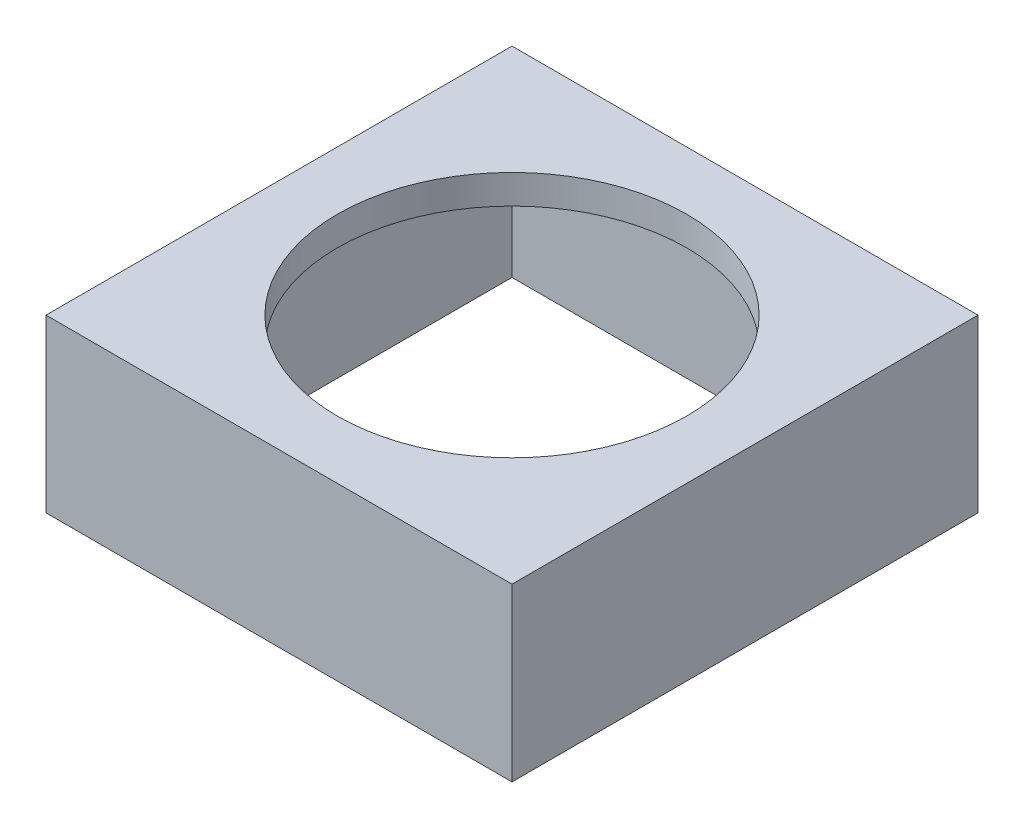
ISO-10303-21;
HEADER;
FILE_DESCRIPTION(('STEP AP214'),'2;1');
FILE_NAME('part.step','',(''),(''),'','','');
FILE_SCHEMA(('AUTOMOTIVE_DESIGN { 1 0 10303 214 1 1 1 1 }'));
ENDSEC;
DATA;
#1=APPLICATION_CONTEXT('core data for automotive mechanical design processes');
#2=APPLICATION_PROTOCOL_DEFINITION('international standard','automotive_design',2000,#1);
#3=PRODUCT_CONTEXT('',#1,'mechanical');
#4=PRODUCT('Part','Part','',(#3));
#5=PRODUCT_RELATED_PRODUCT_CATEGORY('part','',(#4));
#6=PRODUCT_DEFINITION_FORMATION('','',#4);
#7=PRODUCT_DEFINITION_CONTEXT('part definition',#1,'design');
#8=PRODUCT_DEFINITION('design','',#6,#7);
#9=PRODUCT_DEFINITION_SHAPE('','',#8);
#10=(LENGTH_UNIT() NAMED_UNIT(*) SI_UNIT(.MILLI.,.METRE.));
#11=(NAMED_UNIT(*) PLANE_ANGLE_UNIT() SI_UNIT($,.RADIAN.));
#12=(NAMED_UNIT(*) SI_UNIT($,.STERADIAN.) SOLID_ANGLE_UNIT());
#13=UNCERTAINTY_MEASURE_WITH_UNIT(LENGTH_MEASURE(1.E-05),#10,'distance_accuracy_value','');
#14=(GEOMETRIC_REPRESENTATION_CONTEXT(3) GLOBAL_UNCERTAINTY_ASSIGNED_CONTEXT((#13)) GLOBAL_UNIT_ASSIGNED_CONTEXT((#10,
#11,#12)) REPRESENTATION_CONTEXT('',''));
#15=CARTESIAN_POINT('',(0.,0.,0.));
#16=DIRECTION('',(0.,0.,1.));
#17=DIRECTION('',(1.,0.,0.));
#18=AXIS2_PLACEMENT_3D('',#15,#16,#17);
#19=CARTESIAN_POINT('',(-3.5,2.94,-3.5));
#20=DIRECTION('',(1.,0.,0.));
#21=DIRECTION('',(0.,0.,-1.));
#22=AXIS2_PLACEMENT_3D('',#19,#20,#21);
#23=PLANE('',#22);
#24=DIRECTION('',(0.,-1.,0.));
#25=VECTOR('',#24,1.);
#26=CARTESIAN_POINT('',(-3.5,2.94,-3.5));
#27=LINE('',#26,#25);
#28=CARTESIAN_POINT('',(-3.5,2.44,-3.5));
#29=VERTEX_POINT('',#28);
#30=CARTESIAN_POINT('',(-3.5,0.,-3.5));
#31=VERTEX_POINT('',#30);
#32=EDGE_CURVE('E58',#29,#31,#27,.T.);
#33=ORIENTED_EDGE('',*,*,#32,.F.);
#34=DIRECTION('',(0.,0.,1.));
#35=VECTOR('',#34,1.);
#36=CARTESIAN_POINT('',(-3.5,2.44,-3.5));
#37=LINE('',#36,#35);
#38=CARTESIAN_POINT('',(-3.5,2.44,3.5));
#39=VERTEX_POINT('',#38);
#40=EDGE_CURVE('E52',#29,#39,#37,.T.);
#41=ORIENTED_EDGE('',*,*,#40,.T.);
#42=DIRECTION('',(0.,-1.,0.));
#43=VECTOR('',#42,1.);
#44=CARTESIAN_POINT('',(-3.5,2.94,3.5));
#45=LINE('',#44,#43);
#46=CARTESIAN_POINT('',(-3.5,0.,3.5));
#47=VERTEX_POINT('',#46);
#48=EDGE_CURVE('E119',#39,#47,#45,.T.);
#49=ORIENTED_EDGE('',*,*,#48,.T.);
#50=DIRECTION('',(0.,0.,1.));
#51=VECTOR('',#50,1.);
#52=CARTESIAN_POINT('',(-3.5,0.,-3.5));
#53=LINE('',#52,#51);
#54=EDGE_CURVE('E187',#31,#47,#53,.T.);
#55=ORIENTED_EDGE('',*,*,#54,.F.);
#56=EDGE_LOOP('',(#33,#41,#49,#55));
#57=FACE_BOUND('',#56,.T.);
#58=ADVANCED_FACE('F37',(#57),#23,.T.);
#59=CARTESIAN_POINT('',(-3.5,2.94,3.5));
#60=DIRECTION('',(0.,0.,-1.));
#61=DIRECTION('',(-1.,0.,0.));
#62=AXIS2_PLACEMENT_3D('',#59,#60,#61);
#63=PLANE('',#62);
#64=ORIENTED_EDGE('',*,*,#48,.F.);
#65=DIRECTION('',(1.,0.,0.));
#66=VECTOR('',#65,1.);
#67=CARTESIAN_POINT('',(-3.5,2.44,3.5));
#68=LINE('',#67,#66);
#69=CARTESIAN_POINT('',(3.5,2.44,3.5));
#70=VERTEX_POINT('',#69);
#71=EDGE_CURVE('E111',#39,#70,#68,.T.);
#72=ORIENTED_EDGE('',*,*,#71,.T.);
#73=DIRECTION('',(0.,-1.,0.));
#74=VECTOR('',#73,1.);
#75=CARTESIAN_POINT('',(3.5,2.94,3.5));
#76=LINE('',#75,#74);
#77=CARTESIAN_POINT('',(3.5,0.,3.5));
#78=VERTEX_POINT('',#77);
#79=EDGE_CURVE('E110',#70,#78,#76,.T.);
#80=ORIENTED_EDGE('',*,*,#79,.T.);
#81=DIRECTION('',(1.,0.,0.));
#82=VECTOR('',#81,1.);
#83=CARTESIAN_POINT('',(-3.5,0.,3.5));
#84=LINE('',#83,#82);
#85=EDGE_CURVE('E190',#47,#78,#84,.T.);
#86=ORIENTED_EDGE('',*,*,#85,.F.);
#87=EDGE_LOOP('',(#64,#72,#80,#86));
#88=FACE_BOUND('',#87,.T.);
#89=ADVANCED_FACE('F197',(#88),#63,.T.);
#90=CARTESIAN_POINT('',(3.5,2.94,-3.5));
#91=DIRECTION('',(-1.,0.,0.));
#92=DIRECTION('',(0.,0.,1.));
#93=AXIS2_PLACEMENT_3D('',#90,#91,#92);
#94=PLANE('',#93);
#95=ORIENTED_EDGE('',*,*,#79,.F.);
#96=DIRECTION('',(0.,0.,-1.));
#97=VECTOR('',#96,1.);
#98=CARTESIAN_POINT('',(3.5,2.44,-3.5));
#99=LINE('',#98,#97);
#100=CARTESIAN_POINT('',(3.5,2.44,-3.5));
#101=VERTEX_POINT('',#100);
#102=EDGE_CURVE('E102',#70,#101,#99,.T.);
#103=ORIENTED_EDGE('',*,*,#102,.T.);
#104=DIRECTION('',(0.,-1.,0.));
#105=VECTOR('',#104,1.);
#106=CARTESIAN_POINT('',(3.5,2.94,-3.5));
#107=LINE('',#106,#105);
#108=CARTESIAN_POINT('',(3.5,0.,-3.5));
#109=VERTEX_POINT('',#108);
#110=EDGE_CURVE('E109',#101,#109,#107,.T.);
#111=ORIENTED_EDGE('',*,*,#110,.T.);
#112=DIRECTION('',(0.,0.,-1.));
#113=VECTOR('',#112,1.);
#114=CARTESIAN_POINT('',(3.5,0.,-3.5));
#115=LINE('',#114,#113);
#116=EDGE_CURVE('E193',#78,#109,#115,.T.);
#117=ORIENTED_EDGE('',*,*,#116,.F.);
#118=EDGE_LOOP('',(#95,#103,#111,#117));
#119=FACE_BOUND('',#118,.T.);
#120=ADVANCED_FACE('F107',(#119),#94,.T.);
#121=CARTESIAN_POINT('',(-3.5,2.94,-3.5));
#122=DIRECTION('',(0.,0.,1.));
#123=DIRECTION('',(1.,0.,0.));
#124=AXIS2_PLACEMENT_3D('',#121,#122,#123);
#125=PLANE('',#124);
#126=ORIENTED_EDGE('',*,*,#110,.F.);
#127=DIRECTION('',(-1.,0.,0.));
#128=VECTOR('',#127,1.);
#129=CARTESIAN_POINT('',(-3.5,2.44,-3.5));
#130=LINE('',#129,#128);
#131=EDGE_CURVE('E11',#101,#29,#130,.T.);
#132=ORIENTED_EDGE('',*,*,#131,.T.);
#133=ORIENTED_EDGE('',*,*,#32,.T.);
#134=DIRECTION('',(-1.,0.,0.));
#135=VECTOR('',#134,1.);
#136=CARTESIAN_POINT('',(-3.5,0.,-3.5));
#137=LINE('',#136,#135);
#138=EDGE_CURVE('E116',#109,#31,#137,.T.);
#139=ORIENTED_EDGE('',*,*,#138,.F.);
#140=EDGE_LOOP('',(#126,#132,#133,#139));
#141=FACE_BOUND('',#140,.T.);
#142=ADVANCED_FACE('F114',(#141),#125,.T.);
#143=CARTESIAN_POINT('',(0.,2.94,0.));
#144=DIRECTION('',(0.,1.,0.));
#145=DIRECTION('',(0.,0.,1.));
#146=AXIS2_PLACEMENT_3D('',#143,#144,#145);
#147=PLANE('',#146);
#148=DIRECTION('',(0.,0.,1.));
#149=VECTOR('',#148,1.);
#150=CARTESIAN_POINT('',(-4.,2.94,-4.));
#151=LINE('',#150,#149);
#152=CARTESIAN_POINT('',(-4.,2.94,-4.));
#153=VERTEX_POINT('',#152);
#154=CARTESIAN_POINT('',(-4.,2.94,4.));
#155=VERTEX_POINT('',#154);
#156=EDGE_CURVE('E126',#153,#155,#151,.T.);
#157=ORIENTED_EDGE('',*,*,#156,.T.);
#158=DIRECTION('',(1.,0.,0.));
#159=VECTOR('',#158,1.);
#160=CARTESIAN_POINT('',(-4.,2.94,4.));
#161=LINE('',#160,#159);
#162=CARTESIAN_POINT('',(4.,2.94,4.));
#163=VERTEX_POINT('',#162);
#164=EDGE_CURVE('E129',#155,#163,#161,.T.);
#165=ORIENTED_EDGE('',*,*,#164,.T.);
#166=DIRECTION('',(0.,0.,-1.));
#167=VECTOR('',#166,1.);
#168=CARTESIAN_POINT('',(4.,2.94,-4.));
#169=LINE('',#168,#167);
#170=CARTESIAN_POINT('',(4.,2.94,-4.));
#171=VERTEX_POINT('',#170);
#172=EDGE_CURVE('E132',#163,#171,#169,.T.);
#173=ORIENTED_EDGE('',*,*,#172,.T.);
#174=DIRECTION('',(-1.,0.,0.));
#175=VECTOR('',#174,1.);
#176=CARTESIAN_POINT('',(-4.,2.94,-4.));
#177=LINE('',#176,#175);
#178=EDGE_CURVE('E134',#171,#153,#177,.T.);
#179=ORIENTED_EDGE('',*,*,#178,.T.);
#180=EDGE_LOOP('',(#157,#165,#173,#179));
#181=FACE_BOUND('',#180,.T.);
#182=CARTESIAN_POINT('',(0.,2.94,0.));
#183=DIRECTION('',(0.,1.,0.));
#184=DIRECTION('',(0.,0.,1.));
#185=AXIS2_PLACEMENT_3D('',#182,#183,#184);
#186=CIRCLE('',#185,3.);
#187=CARTESIAN_POINT('',(0.,2.94,3.));
#188=VERTEX_POINT('',#187);
#189=EDGE_CURVE('E179',#188,#188,#186,.T.);
#190=ORIENTED_EDGE('',*,*,#189,.F.);
#191=EDGE_LOOP('',(#190));
#192=FACE_BOUND('',#191,.T.);
#193=ADVANCED_FACE('F173',(#181,#192),#147,.T.);
#194=CARTESIAN_POINT('',(0.,0.,0.));
#195=DIRECTION('',(0.,1.,0.));
#196=DIRECTION('',(0.,0.,1.));
#197=AXIS2_PLACEMENT_3D('',#194,#195,#196);
#198=PLANE('',#197);
#199=DIRECTION('',(0.,0.,1.));
#200=VECTOR('',#199,1.);
#201=CARTESIAN_POINT('',(-4.,0.,-4.));
#202=LINE('',#201,#200);
#203=CARTESIAN_POINT('',(-4.,0.,-4.));
#204=VERTEX_POINT('',#203);
#205=CARTESIAN_POINT('',(-4.,0.,4.));
#206=VERTEX_POINT('',#205);
#207=EDGE_CURVE('E125',#204,#206,#202,.T.);
#208=ORIENTED_EDGE('',*,*,#207,.F.);
#209=DIRECTION('',(-1.,0.,0.));
#210=VECTOR('',#209,1.);
#211=CARTESIAN_POINT('',(-4.,0.,-4.));
#212=LINE('',#211,#210);
#213=CARTESIAN_POINT('',(4.,0.,-4.));
#214=VERTEX_POINT('',#213);
#215=EDGE_CURVE('E130',#214,#204,#212,.T.);
#216=ORIENTED_EDGE('',*,*,#215,.F.);
#217=DIRECTION('',(0.,0.,-1.));
#218=VECTOR('',#217,1.);
#219=CARTESIAN_POINT('',(4.,0.,-4.));
#220=LINE('',#219,#218);
#221=CARTESIAN_POINT('',(4.,0.,4.));
#222=VERTEX_POINT('',#221);
#223=EDGE_CURVE('E142',#222,#214,#220,.T.);
#224=ORIENTED_EDGE('',*,*,#223,.F.);
#225=DIRECTION('',(1.,0.,0.));
#226=VECTOR('',#225,1.);
#227=CARTESIAN_POINT('',(-4.,0.,4.));
#228=LINE('',#227,#226);
#229=EDGE_CURVE('E139',#206,#222,#228,.T.);
#230=ORIENTED_EDGE('',*,*,#229,.F.);
#231=EDGE_LOOP('',(#208,#216,#224,#230));
#232=FACE_BOUND('',#231,.T.);
#233=ORIENTED_EDGE('',*,*,#54,.T.);
#234=ORIENTED_EDGE('',*,*,#85,.T.);
#235=ORIENTED_EDGE('',*,*,#116,.T.);
#236=ORIENTED_EDGE('',*,*,#138,.T.);
#237=EDGE_LOOP('',(#233,#234,#235,#236));
#238=FACE_BOUND('',#237,.T.);
#239=ADVANCED_FACE('F161',(#232,#238),#198,.F.);
#240=CARTESIAN_POINT('',(-4.,2.94,-4.));
#241=DIRECTION('',(1.,0.,0.));
#242=DIRECTION('',(0.,0.,-1.));
#243=AXIS2_PLACEMENT_3D('',#240,#241,#242);
#244=PLANE('',#243);
#245=DIRECTION('',(0.,-1.,0.));
#246=VECTOR('',#245,1.);
#247=CARTESIAN_POINT('',(-4.,2.94,-4.));
#248=LINE('',#247,#246);
#249=EDGE_CURVE('E136',#153,#204,#248,.T.);
#250=ORIENTED_EDGE('',*,*,#249,.T.);
#251=ORIENTED_EDGE('',*,*,#207,.T.);
#252=DIRECTION('',(0.,-1.,0.));
#253=VECTOR('',#252,1.);
#254=CARTESIAN_POINT('',(-4.,2.94,4.));
#255=LINE('',#254,#253);
#256=EDGE_CURVE('E45',#155,#206,#255,.T.);
#257=ORIENTED_EDGE('',*,*,#256,.F.);
#258=ORIENTED_EDGE('',*,*,#156,.F.);
#259=EDGE_LOOP('',(#250,#251,#257,#258));
#260=FACE_BOUND('',#259,.T.);
#261=ADVANCED_FACE('F39',(#260),#244,.F.);
#262=CARTESIAN_POINT('',(-4.,2.94,4.));
#263=DIRECTION('',(0.,0.,-1.));
#264=DIRECTION('',(-1.,0.,0.));
#265=AXIS2_PLACEMENT_3D('',#262,#263,#264);
#266=PLANE('',#265);
#267=ORIENTED_EDGE('',*,*,#256,.T.);
#268=ORIENTED_EDGE('',*,*,#229,.T.);
#269=DIRECTION('',(0.,-1.,0.));
#270=VECTOR('',#269,1.);
#271=CARTESIAN_POINT('',(4.,2.94,4.));
#272=LINE('',#271,#270);
#273=EDGE_CURVE('E150',#163,#222,#272,.T.);
#274=ORIENTED_EDGE('',*,*,#273,.F.);
#275=ORIENTED_EDGE('',*,*,#164,.F.);
#276=EDGE_LOOP('',(#267,#268,#274,#275));
#277=FACE_BOUND('',#276,.T.);
#278=ADVANCED_FACE('F154',(#277),#266,.F.);
#279=CARTESIAN_POINT('',(4.,2.94,-4.));
#280=DIRECTION('',(-1.,0.,0.));
#281=DIRECTION('',(0.,0.,1.));
#282=AXIS2_PLACEMENT_3D('',#279,#280,#281);
#283=PLANE('',#282);
#284=ORIENTED_EDGE('',*,*,#273,.T.);
#285=ORIENTED_EDGE('',*,*,#223,.T.);
#286=DIRECTION('',(0.,-1.,0.));
#287=VECTOR('',#286,1.);
#288=CARTESIAN_POINT('',(4.,2.94,-4.));
#289=LINE('',#288,#287);
#290=EDGE_CURVE('E148',#171,#214,#289,.T.);
#291=ORIENTED_EDGE('',*,*,#290,.F.);
#292=ORIENTED_EDGE('',*,*,#172,.F.);
#293=EDGE_LOOP('',(#284,#285,#291,#292));
#294=FACE_BOUND('',#293,.T.);
#295=ADVANCED_FACE('F171',(#294),#283,.F.);
#296=CARTESIAN_POINT('',(-4.,2.94,-4.));
#297=DIRECTION('',(0.,0.,1.));
#298=DIRECTION('',(1.,0.,0.));
#299=AXIS2_PLACEMENT_3D('',#296,#297,#298);
#300=PLANE('',#299);
#301=ORIENTED_EDGE('',*,*,#290,.T.);
#302=ORIENTED_EDGE('',*,*,#215,.T.);
#303=ORIENTED_EDGE('',*,*,#249,.F.);
#304=ORIENTED_EDGE('',*,*,#178,.F.);
#305=EDGE_LOOP('',(#301,#302,#303,#304));
#306=FACE_BOUND('',#305,.T.);
#307=ADVANCED_FACE('F167',(#306),#300,.F.);
#308=CARTESIAN_POINT('',(0.,2.44,0.));
#309=DIRECTION('',(0.,1.,0.));
#310=DIRECTION('',(0.,0.,1.));
#311=AXIS2_PLACEMENT_3D('',#308,#309,#310);
#312=PLANE('',#311);
#313=ORIENTED_EDGE('',*,*,#40,.F.);
#314=ORIENTED_EDGE('',*,*,#131,.F.);
#315=ORIENTED_EDGE('',*,*,#102,.F.);
#316=ORIENTED_EDGE('',*,*,#71,.F.);
#317=EDGE_LOOP('',(#313,#314,#315,#316));
#318=FACE_BOUND('',#317,.T.);
#319=CARTESIAN_POINT('',(0.,2.44,0.));
#320=DIRECTION('',(0.,1.,0.));
#321=DIRECTION('',(0.,0.,1.));
#322=AXIS2_PLACEMENT_3D('',#319,#320,#321);
#323=CIRCLE('',#322,3.);
#324=CARTESIAN_POINT('',(0.,2.44,3.));
#325=VERTEX_POINT('',#324);
#326=EDGE_CURVE('E112',#325,#325,#323,.T.);
#327=ORIENTED_EDGE('',*,*,#326,.T.);
#328=EDGE_LOOP('',(#327));
#329=FACE_BOUND('',#328,.T.);
#330=ADVANCED_FACE('F100',(#318,#329),#312,.F.);
#331=CARTESIAN_POINT('',(0.,2.44,0.));
#332=DIRECTION('',(0.,1.,0.));
#333=DIRECTION('',(0.,0.,1.));
#334=AXIS2_PLACEMENT_3D('',#331,#332,#333);
#335=CYLINDRICAL_SURFACE('',#334,3.);
#336=ORIENTED_EDGE('',*,*,#326,.F.);
#337=EDGE_LOOP('',(#336));
#338=FACE_BOUND('',#337,.T.);
#339=ORIENTED_EDGE('',*,*,#189,.T.);
#340=EDGE_LOOP('',(#339));
#341=FACE_BOUND('',#340,.T.);
#342=ADVANCED_FACE('F260',(#338,#341),#335,.F.);
#343=CLOSED_SHELL('',(#58,#89,#120,#142,#193,#239,#261,#278,#295,#307,#330,#342));
#344=MANIFOLD_SOLID_BREP('B2',#343);
#345=ADVANCED_BREP_SHAPE_REPRESENTATION('',(#18,#344),#14);
#346=SHAPE_DEFINITION_REPRESENTATION(#9,#345);
ENDSEC;
END-ISO-10303-21;
